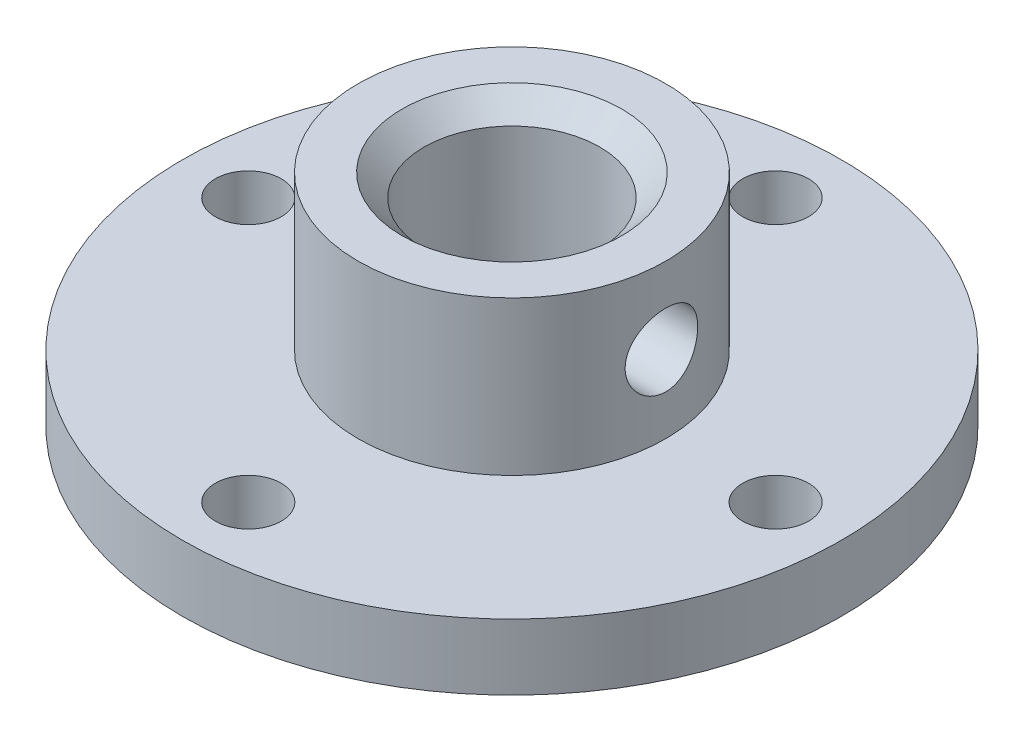
ISO-10303-21;
HEADER;
FILE_DESCRIPTION(('STEP AP214'),'2;1');
FILE_NAME('part.step','',(''),(''),'','','');
FILE_SCHEMA(('AUTOMOTIVE_DESIGN { 1 0 10303 214 1 1 1 1 }'));
ENDSEC;
DATA;
#1=APPLICATION_CONTEXT('core data for automotive mechanical design processes');
#2=APPLICATION_PROTOCOL_DEFINITION('international standard','automotive_design',2000,#1);
#3=PRODUCT_CONTEXT('',#1,'mechanical');
#4=PRODUCT('Part','Part','',(#3));
#5=PRODUCT_RELATED_PRODUCT_CATEGORY('part','',(#4));
#6=PRODUCT_DEFINITION_FORMATION('','',#4);
#7=PRODUCT_DEFINITION_CONTEXT('part definition',#1,'design');
#8=PRODUCT_DEFINITION('design','',#6,#7);
#9=PRODUCT_DEFINITION_SHAPE('','',#8);
#10=(LENGTH_UNIT() NAMED_UNIT(*) SI_UNIT(.MILLI.,.METRE.));
#11=(NAMED_UNIT(*) PLANE_ANGLE_UNIT() SI_UNIT($,.RADIAN.));
#12=(NAMED_UNIT(*) SI_UNIT($,.STERADIAN.) SOLID_ANGLE_UNIT());
#13=UNCERTAINTY_MEASURE_WITH_UNIT(LENGTH_MEASURE(1.E-05),#10,'distance_accuracy_value','');
#14=(GEOMETRIC_REPRESENTATION_CONTEXT(3) GLOBAL_UNCERTAINTY_ASSIGNED_CONTEXT((#13)) GLOBAL_UNIT_ASSIGNED_CONTEXT((#10,
#11,#12)) REPRESENTATION_CONTEXT('',''));
#15=CARTESIAN_POINT('',(0.,0.,0.));
#16=DIRECTION('',(0.,0.,1.));
#17=DIRECTION('',(1.,0.,0.));
#18=AXIS2_PLACEMENT_3D('',#15,#16,#17);
#19=CARTESIAN_POINT('',(0.,3.,0.));
#20=DIRECTION('',(0.,-1.,0.));
#21=DIRECTION('',(0.,0.,-1.));
#22=AXIS2_PLACEMENT_3D('',#19,#20,#21);
#23=CYLINDRICAL_SURFACE('',#22,4.);
#24=CARTESIAN_POINT('',(0.,9.,0.));
#25=DIRECTION('',(0.,1.,0.));
#26=DIRECTION('',(0.,0.,1.));
#27=AXIS2_PLACEMENT_3D('',#24,#25,#26);
#28=CIRCLE('',#27,4.);
#29=CARTESIAN_POINT('',(0.,9.,4.));
#30=VERTEX_POINT('',#29);
#31=EDGE_CURVE('E49',#30,#30,#28,.T.);
#32=ORIENTED_EDGE('',*,*,#31,.T.);
#33=EDGE_LOOP('',(#32));
#34=FACE_BOUND('',#33,.T.);
#35=CARTESIAN_POINT('',(3.64383040220041,6.5,1.65));
#36=CARTESIAN_POINT('',(3.64383945275153,6.58809648022568,1.64999056813102));
#37=CARTESIAN_POINT('',(3.64707173267573,6.67634043197359,1.64289989177358));
#38=CARTESIAN_POINT('',(3.65959209124688,6.85028706107888,1.61480845546373));
#39=CARTESIAN_POINT('',(3.66889676295874,6.9359821005976,1.5937695789634));
#40=CARTESIAN_POINT('',(3.69231325052125,7.10200293813063,1.53873536249638));
#41=CARTESIAN_POINT('',(3.70640571161012,7.1823488202186,1.50479212400174));
#42=CARTESIAN_POINT('',(3.73778230052357,7.33618176683423,1.42506535594207));
#43=CARTESIAN_POINT('',(3.75506562873472,7.40967054278404,1.37928479159595));
#44=CARTESIAN_POINT('',(3.7920553041855,7.5522286878465,1.27419856290372));
#45=CARTESIAN_POINT('',(3.81184277704779,7.62082925578021,1.2142851824136));
#46=CARTESIAN_POINT('',(3.85094363418238,7.74735477190876,1.08391072165483));
#47=CARTESIAN_POINT('',(3.87025683535296,7.80527565147222,1.01344563996364));
#48=CARTESIAN_POINT('',(3.90721575035942,7.91117137130187,0.860301943593383));
#49=CARTESIAN_POINT('',(3.92475616703247,7.95862093270616,0.777232390113592));
#50=CARTESIAN_POINT('',(3.95520283117798,8.0386701453217,0.603436361875858));
#51=CARTESIAN_POINT('',(3.96811109652272,8.07127626434656,0.512713242513046));
#52=CARTESIAN_POINT('',(3.98726403378776,8.11902070665623,0.331105172304399));
#53=CARTESIAN_POINT('',(3.99381564337609,8.13496684792324,0.240465625184493));
#54=CARTESIAN_POINT('',(4.0006306156112,8.15154665185517,0.0575763551498658));
#55=CARTESIAN_POINT('',(4.00089647540932,8.15218639532201,-0.0346727137709547));
#56=CARTESIAN_POINT('',(3.99529224160632,8.13856350386341,-0.212297380895985));
#57=CARTESIAN_POINT('',(3.98978733384658,8.1251878162829,-0.297754665400396));
#58=CARTESIAN_POINT('',(3.97375926025944,8.08543118255225,-0.465085845235279));
#59=CARTESIAN_POINT('',(3.96323572489496,8.05904927870932,-0.546959476205493));
#60=CARTESIAN_POINT('',(3.93798907731603,7.99371233827982,-0.706295606817229));
#61=CARTESIAN_POINT('',(3.92320447216362,7.95457201007513,-0.78367197976247));
#62=CARTESIAN_POINT('',(3.89088763760773,7.8650087208134,-0.930960489992466));
#63=CARTESIAN_POINT('',(3.87335444442336,7.8145817994967,-1.00086999453932));
#64=CARTESIAN_POINT('',(3.83587133640027,7.69981176097137,-1.13638530947041));
#65=CARTESIAN_POINT('',(3.8158381454309,7.63474658910128,-1.20135746318645));
#66=CARTESIAN_POINT('',(3.77653142784555,7.49459033367843,-1.31973838423493));
#67=CARTESIAN_POINT('',(3.75725818494773,7.4194955507367,-1.37314286572202));
#68=CARTESIAN_POINT('',(3.72106607156909,7.25840159645269,-1.46845339844828));
#69=CARTESIAN_POINT('',(3.70424107982558,7.17213242830735,-1.50994179309277));
#70=CARTESIAN_POINT('',(3.67596385006485,6.99295332859411,-1.57754508127096));
#71=CARTESIAN_POINT('',(3.66450786071417,6.90004808612619,-1.60367071206121));
#72=CARTESIAN_POINT('',(3.64919091711418,6.71657710481502,-1.63821320355942));
#73=CARTESIAN_POINT('',(3.64489111171831,6.62624169881714,-1.64765569454682));
#74=CARTESIAN_POINT('',(3.64311980380967,6.44519437030141,-1.65157101672826));
#75=CARTESIAN_POINT('',(3.64564601607449,6.35448258394072,-1.64604885780402));
#76=CARTESIAN_POINT('',(3.65678944366161,6.18119899095053,-1.62112710501827));
#77=CARTESIAN_POINT('',(3.66501803861664,6.09847182032539,-1.60261202118543));
#78=CARTESIAN_POINT('',(3.68614612916707,5.93736293562003,-1.55339580262015));
#79=CARTESIAN_POINT('',(3.69904670212356,5.85898222864834,-1.52269185697123));
#80=CARTESIAN_POINT('',(3.72872477858182,5.70512099430436,-1.44853902204985));
#81=CARTESIAN_POINT('',(3.74564214050945,5.62989980522075,-1.40460979308264));
#82=CARTESIAN_POINT('',(3.78124523189864,5.48753983057027,-1.30573455409451));
#83=CARTESIAN_POINT('',(3.79993171387674,5.42040451226488,-1.25078384473684));
#84=CARTESIAN_POINT('',(3.83876011670653,5.29057037355329,-1.12627542162099));
#85=CARTESIAN_POINT('',(3.85889967217623,5.22864826295128,-1.05590387126704));
#86=CARTESIAN_POINT('',(3.89698114804694,5.11735714433794,-0.905297980080106));
#87=CARTESIAN_POINT('',(3.91492292631236,5.0679889479968,-0.825063002026906));
#88=CARTESIAN_POINT('',(3.94668767391886,4.98329586579321,-0.65651681688327));
#89=CARTESIAN_POINT('',(3.96050313975064,4.94799652499727,-0.568191273870494));
#90=CARTESIAN_POINT('',(3.98237104121021,4.89300834314125,-0.38614083360518));
#91=CARTESIAN_POINT('',(3.9904268305481,4.87331041706106,-0.292419112817564));
#92=CARTESIAN_POINT('',(3.9994889299446,4.85121177107952,-0.109187189544839));
#93=CARTESIAN_POINT('',(4.00094173424749,4.84771517125806,-0.0198303081186384));
#94=CARTESIAN_POINT('',(3.99786220239438,4.85518543437028,0.158161739195409));
#95=CARTESIAN_POINT('',(3.99333087896147,4.86614984999545,0.246797024648477));
#96=CARTESIAN_POINT('',(3.979024148364,4.90144464213556,0.417705375935874));
#97=CARTESIAN_POINT('',(3.96943363922013,4.92530444211455,0.500092371627849));
#98=CARTESIAN_POINT('',(3.94605480923816,4.98520411487999,0.659667355734158));
#99=CARTESIAN_POINT('',(3.93226568297162,5.02124632478668,0.736854343148742));
#100=CARTESIAN_POINT('',(3.90105808483759,5.10630452668639,0.887661133732617));
#101=CARTESIAN_POINT('',(3.88350423911689,5.15583125677293,0.960964214361148));
#102=CARTESIAN_POINT('',(3.84685709666619,5.26570284679,1.09852932170704));
#103=CARTESIAN_POINT('',(3.82776324400832,5.32605162308081,1.1627880603165));
#104=CARTESIAN_POINT('',(3.78859741195738,5.46058752735466,1.28487769945047));
#105=CARTESIAN_POINT('',(3.76854475207571,5.53542775688494,1.34199767947157));
#106=CARTESIAN_POINT('',(3.73105419200533,5.69426597568106,1.4429647467733));
#107=CARTESIAN_POINT('',(3.7136177396712,5.77826899170959,1.48680449811903));
#108=CARTESIAN_POINT('',(3.68370387904713,5.95272844126989,1.55944447766651));
#109=CARTESIAN_POINT('',(3.67119480418033,6.0431391080911,1.58834112875234));
#110=CARTESIAN_POINT('',(3.65281837075147,6.22804714407836,1.63017263567573));
#111=CARTESIAN_POINT('',(3.64692873900432,6.32252969087687,1.64316103312974));
#112=CARTESIAN_POINT('',(3.64414054419779,6.44486331364264,1.6493120932942));
#113=CARTESIAN_POINT('',(3.64382756923722,6.47242443228502,1.6500029523216));
#114=CARTESIAN_POINT('',(3.64383040220041,6.5,1.65));
#115=B_SPLINE_CURVE_WITH_KNOTS('',3,(#35,#36,#37,#38,#39,#40,#41,#42,#43,#44,#45,#46,#47,#48,
#49,#50,#51,#52,#53,#54,#55,#56,#57,#58,#59,#60,#61,#62,#63,#64,#65,#66,#67,#68,#69,#70,#71,#72,
#73,#74,#75,#76,#77,#78,#79,#80,#81,#82,#83,#84,#85,#86,#87,#88,#89,#90,#91,#92,#93,#94,#95,#96,
#97,#98,#99,#100,#101,#102,#103,#104,#105,#106,#107,#108,#109,#110,#111,#112,#113,#114),
.UNSPECIFIED.,.T.,.F.,(4,2,2,2,2,2,2,2,2,2,2,2,2,2,2,2,2,2,2,2,2,2,2,2,2,2,2,2,2,2,2,2,2,2,2,2,
2,2,2,4),(0.,0.264211724660745,0.529148459018597,0.793026677872049,1.05683885985756,
1.33523297260792,1.61373292676209,1.90403076094908,2.19420198072699,2.4695381624427,
2.74476495901024,3.00356896819766,3.26239203686791,3.5251552692474,3.78801084539546,
4.06907613148065,4.35024537535725,4.64031806272423,4.9301877724111,5.20152035698263,
5.47276211576042,5.72713321026166,5.98156300028881,6.24665916965709,6.51186861189124,
6.79815687284347,7.08446363898863,7.37128791456171,7.65794504349151,7.92489841526079,
8.19180661499935,8.44957452423759,8.70739191275388,8.97680852354695,9.24632283025307,
9.53374725602175,9.82133016535516,10.1070334851925,10.3917725616094,10.4744749384332),.UNSPECIFIED.);
#116=CARTESIAN_POINT('',(3.64383040220041,6.5,1.65));
#117=VERTEX_POINT('',#116);
#118=EDGE_CURVE('E86',#117,#117,#115,.T.);
#119=ORIENTED_EDGE('',*,*,#118,.F.);
#120=EDGE_LOOP('',(#119));
#121=FACE_BOUND('',#120,.T.);
#122=CARTESIAN_POINT('',(0.,1.5,0.));
#123=DIRECTION('',(0.,-1.,0.));
#124=DIRECTION('',(0.,0.,-1.));
#125=AXIS2_PLACEMENT_3D('',#122,#123,#124);
#126=CIRCLE('',#125,4.);
#127=CARTESIAN_POINT('',(0.,1.5,-4.));
#128=VERTEX_POINT('',#127);
#129=EDGE_CURVE('E74',#128,#128,#126,.T.);
#130=ORIENTED_EDGE('',*,*,#129,.T.);
#131=EDGE_LOOP('',(#130));
#132=FACE_BOUND('',#131,.T.);
#133=ADVANCED_FACE('F42',(#34,#121,#132),#23,.F.);
#134=CARTESIAN_POINT('',(0.,3.,0.));
#135=DIRECTION('',(0.,1.,0.));
#136=DIRECTION('',(0.,0.,1.));
#137=AXIS2_PLACEMENT_3D('',#134,#135,#136);
#138=PLANE('',#137);
#139=CARTESIAN_POINT('',(12.,3.,1.25693328198353E-13));
#140=DIRECTION('',(0.,1.,0.));
#141=DIRECTION('',(0.,0.,1.));
#142=AXIS2_PLACEMENT_3D('',#139,#140,#141);
#143=CIRCLE('',#142,1.5);
#144=CARTESIAN_POINT('',(12.,3.,1.50000000000013));
#145=VERTEX_POINT('',#144);
#146=EDGE_CURVE('E73',#145,#145,#143,.T.);
#147=ORIENTED_EDGE('',*,*,#146,.F.);
#148=EDGE_LOOP('',(#147));
#149=FACE_BOUND('',#148,.T.);
#150=CARTESIAN_POINT('',(0.,3.,12.));
#151=DIRECTION('',(0.,1.,0.));
#152=DIRECTION('',(0.,0.,1.));
#153=AXIS2_PLACEMENT_3D('',#150,#151,#152);
#154=CIRCLE('',#153,1.5);
#155=CARTESIAN_POINT('',(0.,3.,13.5));
#156=VERTEX_POINT('',#155);
#157=EDGE_CURVE('E277',#156,#156,#154,.T.);
#158=ORIENTED_EDGE('',*,*,#157,.F.);
#159=EDGE_LOOP('',(#158));
#160=FACE_BOUND('',#159,.T.);
#161=CARTESIAN_POINT('',(-12.,3.,0.));
#162=DIRECTION('',(0.,1.,0.));
#163=DIRECTION('',(0.,0.,1.));
#164=AXIS2_PLACEMENT_3D('',#161,#162,#163);
#165=CIRCLE('',#164,1.5);
#166=CARTESIAN_POINT('',(-12.,3.,1.49999999999996));
#167=VERTEX_POINT('',#166);
#168=EDGE_CURVE('E274',#167,#167,#165,.T.);
#169=ORIENTED_EDGE('',*,*,#168,.F.);
#170=EDGE_LOOP('',(#169));
#171=FACE_BOUND('',#170,.T.);
#172=CARTESIAN_POINT('',(0.,3.,-12.));
#173=DIRECTION('',(0.,1.,0.));
#174=DIRECTION('',(0.,0.,1.));
#175=AXIS2_PLACEMENT_3D('',#172,#173,#174);
#176=CIRCLE('',#175,1.5);
#177=CARTESIAN_POINT('',(0.,3.,-10.5));
#178=VERTEX_POINT('',#177);
#179=EDGE_CURVE('E271',#178,#178,#176,.T.);
#180=ORIENTED_EDGE('',*,*,#179,.F.);
#181=EDGE_LOOP('',(#180));
#182=FACE_BOUND('',#181,.T.);
#183=CARTESIAN_POINT('',(0.,3.,0.));
#184=DIRECTION('',(0.,1.,0.));
#185=DIRECTION('',(0.,0.,1.));
#186=AXIS2_PLACEMENT_3D('',#183,#184,#185);
#187=CIRCLE('',#186,15.);
#188=CARTESIAN_POINT('',(0.,3.,15.));
#189=VERTEX_POINT('',#188);
#190=EDGE_CURVE('E53',#189,#189,#187,.T.);
#191=ORIENTED_EDGE('',*,*,#190,.T.);
#192=EDGE_LOOP('',(#191));
#193=FACE_BOUND('',#192,.T.);
#194=CARTESIAN_POINT('',(0.,3.,0.));
#195=DIRECTION('',(0.,1.,0.));
#196=DIRECTION('',(0.,0.,1.));
#197=AXIS2_PLACEMENT_3D('',#194,#195,#196);
#198=CIRCLE('',#197,7.);
#199=CARTESIAN_POINT('',(0.,3.,7.));
#200=VERTEX_POINT('',#199);
#201=EDGE_CURVE('E107',#200,#200,#198,.T.);
#202=ORIENTED_EDGE('',*,*,#201,.F.);
#203=EDGE_LOOP('',(#202));
#204=FACE_BOUND('',#203,.T.);
#205=ADVANCED_FACE('F114',(#149,#160,#171,#182,#193,#204),#138,.T.);
#206=CARTESIAN_POINT('',(0.,0.,0.));
#207=DIRECTION('',(0.,1.,0.));
#208=DIRECTION('',(0.,0.,1.));
#209=AXIS2_PLACEMENT_3D('',#206,#207,#208);
#210=PLANE('',#209);
#211=CARTESIAN_POINT('',(12.,0.,1.25693328198353E-13));
#212=DIRECTION('',(0.,1.,0.));
#213=DIRECTION('',(0.,0.,1.));
#214=AXIS2_PLACEMENT_3D('',#211,#212,#213);
#215=CIRCLE('',#214,1.5);
#216=CARTESIAN_POINT('',(12.,0.,1.50000000000013));
#217=VERTEX_POINT('',#216);
#218=EDGE_CURVE('E60',#217,#217,#215,.T.);
#219=ORIENTED_EDGE('',*,*,#218,.T.);
#220=EDGE_LOOP('',(#219));
#221=FACE_BOUND('',#220,.T.);
#222=CARTESIAN_POINT('',(0.,0.,12.));
#223=DIRECTION('',(0.,1.,0.));
#224=DIRECTION('',(0.,0.,1.));
#225=AXIS2_PLACEMENT_3D('',#222,#223,#224);
#226=CIRCLE('',#225,1.5);
#227=CARTESIAN_POINT('',(0.,0.,13.5));
#228=VERTEX_POINT('',#227);
#229=EDGE_CURVE('E64',#228,#228,#226,.T.);
#230=ORIENTED_EDGE('',*,*,#229,.T.);
#231=EDGE_LOOP('',(#230));
#232=FACE_BOUND('',#231,.T.);
#233=CARTESIAN_POINT('',(-12.,0.,0.));
#234=DIRECTION('',(0.,1.,0.));
#235=DIRECTION('',(0.,0.,1.));
#236=AXIS2_PLACEMENT_3D('',#233,#234,#235);
#237=CIRCLE('',#236,1.5);
#238=CARTESIAN_POINT('',(-12.,0.,1.49999999999996));
#239=VERTEX_POINT('',#238);
#240=EDGE_CURVE('E67',#239,#239,#237,.T.);
#241=ORIENTED_EDGE('',*,*,#240,.T.);
#242=EDGE_LOOP('',(#241));
#243=FACE_BOUND('',#242,.T.);
#244=CARTESIAN_POINT('',(0.,0.,-12.));
#245=DIRECTION('',(0.,1.,0.));
#246=DIRECTION('',(0.,0.,1.));
#247=AXIS2_PLACEMENT_3D('',#244,#245,#246);
#248=CIRCLE('',#247,1.5);
#249=CARTESIAN_POINT('',(0.,0.,-10.5));
#250=VERTEX_POINT('',#249);
#251=EDGE_CURVE('E70',#250,#250,#248,.T.);
#252=ORIENTED_EDGE('',*,*,#251,.T.);
#253=EDGE_LOOP('',(#252));
#254=FACE_BOUND('',#253,.T.);
#255=CARTESIAN_POINT('',(0.,0.,0.));
#256=DIRECTION('',(0.,-1.,0.));
#257=DIRECTION('',(0.,0.,-1.));
#258=AXIS2_PLACEMENT_3D('',#255,#256,#257);
#259=CIRCLE('',#258,6.5);
#260=CARTESIAN_POINT('',(0.,0.,-6.5));
#261=VERTEX_POINT('',#260);
#262=EDGE_CURVE('E63',#261,#261,#259,.T.);
#263=ORIENTED_EDGE('',*,*,#262,.F.);
#264=EDGE_LOOP('',(#263));
#265=FACE_BOUND('',#264,.T.);
#266=CARTESIAN_POINT('',(0.,0.,0.));
#267=DIRECTION('',(0.,1.,0.));
#268=DIRECTION('',(0.,0.,1.));
#269=AXIS2_PLACEMENT_3D('',#266,#267,#268);
#270=CIRCLE('',#269,15.);
#271=CARTESIAN_POINT('',(0.,0.,15.));
#272=VERTEX_POINT('',#271);
#273=EDGE_CURVE('E57',#272,#272,#270,.T.);
#274=ORIENTED_EDGE('',*,*,#273,.F.);
#275=EDGE_LOOP('',(#274));
#276=FACE_BOUND('',#275,.T.);
#277=ADVANCED_FACE('F117',(#221,#232,#243,#254,#265,#276),#210,.F.);
#278=CARTESIAN_POINT('',(0.,3.,0.));
#279=DIRECTION('',(0.,-1.,0.));
#280=DIRECTION('',(0.,0.,-1.));
#281=AXIS2_PLACEMENT_3D('',#278,#279,#280);
#282=CYLINDRICAL_SURFACE('',#281,15.);
#283=ORIENTED_EDGE('',*,*,#190,.F.);
#284=EDGE_LOOP('',(#283));
#285=FACE_BOUND('',#284,.T.);
#286=ORIENTED_EDGE('',*,*,#273,.T.);
#287=EDGE_LOOP('',(#286));
#288=FACE_BOUND('',#287,.T.);
#289=ADVANCED_FACE('F120',(#285,#288),#282,.T.);
#290=CARTESIAN_POINT('',(0.,10.,0.));
#291=DIRECTION('',(0.,1.,0.));
#292=DIRECTION('',(0.,0.,1.));
#293=AXIS2_PLACEMENT_3D('',#290,#291,#292);
#294=PLANE('',#293);
#295=CARTESIAN_POINT('',(0.,10.,0.));
#296=DIRECTION('',(0.,1.,0.));
#297=DIRECTION('',(0.,0.,1.));
#298=AXIS2_PLACEMENT_3D('',#295,#296,#297);
#299=CIRCLE('',#298,5.);
#300=CARTESIAN_POINT('',(0.,10.,5.));
#301=VERTEX_POINT('',#300);
#302=EDGE_CURVE('E11',#301,#301,#299,.F.);
#303=ORIENTED_EDGE('',*,*,#302,.T.);
#304=EDGE_LOOP('',(#303));
#305=FACE_BOUND('',#304,.T.);
#306=CARTESIAN_POINT('',(0.,10.,0.));
#307=DIRECTION('',(0.,1.,0.));
#308=DIRECTION('',(0.,0.,1.));
#309=AXIS2_PLACEMENT_3D('',#306,#307,#308);
#310=CIRCLE('',#309,7.);
#311=CARTESIAN_POINT('',(0.,10.,7.));
#312=VERTEX_POINT('',#311);
#313=EDGE_CURVE('E109',#312,#312,#310,.T.);
#314=ORIENTED_EDGE('',*,*,#313,.T.);
#315=EDGE_LOOP('',(#314));
#316=FACE_BOUND('',#315,.T.);
#317=ADVANCED_FACE('F98',(#305,#316),#294,.T.);
#318=CARTESIAN_POINT('',(0.,10.,0.));
#319=DIRECTION('',(0.,-1.,0.));
#320=DIRECTION('',(0.,0.,-1.));
#321=AXIS2_PLACEMENT_3D('',#318,#319,#320);
#322=CYLINDRICAL_SURFACE('',#321,7.);
#323=CARTESIAN_POINT('',(6.80275679412398,6.5,1.65));
#324=CARTESIAN_POINT('',(6.80275861136205,6.59128900002348,1.64999713007316));
#325=CARTESIAN_POINT('',(6.80461440498174,6.6826109983811,1.64239813439995));
#326=CARTESIAN_POINT('',(6.81182064992733,6.86264456343403,1.61224414767597));
#327=CARTESIAN_POINT('',(6.81717336620826,6.95135439928855,1.58967946321206));
#328=CARTESIAN_POINT('',(6.83073431325551,7.12353351252337,1.53035515036094));
#329=CARTESIAN_POINT('',(6.83893911932177,7.2070089339595,1.49361254058449));
#330=CARTESIAN_POINT('',(6.85727558075245,7.36661653279005,1.40702581854958));
#331=CARTESIAN_POINT('',(6.86740726130097,7.44274861418793,1.3571815350499));
#332=CARTESIAN_POINT('',(6.88867782513987,7.58699982868595,1.24476461908352));
#333=CARTESIAN_POINT('',(6.89983131541127,7.65495404527719,1.18198309355868));
#334=CARTESIAN_POINT('',(6.92176152937784,7.77947171170117,1.04592427298928));
#335=CARTESIAN_POINT('',(6.93253822068664,7.83603418437752,0.972646078487497));
#336=CARTESIAN_POINT('',(6.95266103704034,7.93682696981727,0.816555491676996));
#337=CARTESIAN_POINT('',(6.96198791366554,7.98089686123285,0.733636814479666));
#338=CARTESIAN_POINT('',(6.97799434603916,8.05441290827777,0.561312838562636));
#339=CARTESIAN_POINT('',(6.98467424785277,8.08386097569016,0.471908389601372));
#340=CARTESIAN_POINT('',(6.99453084372035,8.12677370217112,0.290868022052414));
#341=CARTESIAN_POINT('',(6.99776875317269,8.14051799396695,0.19930177571546));
#342=CARTESIAN_POINT('',(7.00058928212562,8.15250913676126,0.0151097839078777));
#343=CARTESIAN_POINT('',(7.00017238432294,8.15075803426303,-0.0775158200378351));
#344=CARTESIAN_POINT('',(6.99577641572093,8.13201259498984,-0.259263367840032));
#345=CARTESIAN_POINT('',(6.99186783471482,8.11531988499546,-0.348418380319068));
#346=CARTESIAN_POINT('',(6.98100889430398,8.06764792556427,-0.52262462498376));
#347=CARTESIAN_POINT('',(6.97405838372646,8.03666796609913,-0.607675652983099));
#348=CARTESIAN_POINT('',(6.95778608866946,7.96104622960672,-0.772074386794551));
#349=CARTESIAN_POINT('',(6.94844521053821,7.91629382953034,-0.851369239725045));
#350=CARTESIAN_POINT('',(6.92841069918987,7.81448077411501,-1.00143136070301));
#351=CARTESIAN_POINT('',(6.91771685448099,7.75741819349896,-1.07219729215003));
#352=CARTESIAN_POINT('',(6.89584251761335,7.63097547490599,-1.20498965605832));
#353=CARTESIAN_POINT('',(6.88465650871199,7.56133150430551,-1.26676421005725));
#354=CARTESIAN_POINT('',(6.8632971795881,7.4125556788502,-1.37780936391993));
#355=CARTESIAN_POINT('',(6.85312389657327,7.33342347563159,-1.42707950447265));
#356=CARTESIAN_POINT('',(6.83492437266263,7.16746474019295,-1.51185477157774));
#357=CARTESIAN_POINT('',(6.82690665922475,7.08060940604915,-1.54730546989208));
#358=CARTESIAN_POINT('',(6.8140390867396,6.90193872243084,-1.6030277151278));
#359=CARTESIAN_POINT('',(6.80918863409247,6.81012430586923,-1.62330210645788));
#360=CARTESIAN_POINT('',(6.80332774943589,6.62646144305076,-1.64769127898038));
#361=CARTESIAN_POINT('',(6.80222947433876,6.53466484026994,-1.65217579860456));
#362=CARTESIAN_POINT('',(6.80375919481422,6.35163542341626,-1.64586488795024));
#363=CARTESIAN_POINT('',(6.80638688917233,6.26040256436811,-1.63507069283233));
#364=CARTESIAN_POINT('',(6.81498886694796,6.08242254925254,-1.59883140460811));
#365=CARTESIAN_POINT('',(6.82091521063605,5.99563015434626,-1.57359604251708));
#366=CARTESIAN_POINT('',(6.83540229380027,5.82750631336549,-1.50942069873873));
#367=CARTESIAN_POINT('',(6.84396331787599,5.74617545840622,-1.47047923644585));
#368=CARTESIAN_POINT('',(6.86294389007106,5.58970094341062,-1.37920410959565));
#369=CARTESIAN_POINT('',(6.87339357272798,5.51469181525747,-1.32664621508517));
#370=CARTESIAN_POINT('',(6.89489755256543,5.37442199370178,-1.20991829013253));
#371=CARTESIAN_POINT('',(6.90595193742742,5.30916271916839,-1.14574657256199));
#372=CARTESIAN_POINT('',(6.92771364919943,5.18877701795745,-1.00592681617982));
#373=CARTESIAN_POINT('',(6.93840801965821,5.13390464452841,-0.930057660220532));
#374=CARTESIAN_POINT('',(6.95799159344945,5.03768198322209,-0.76996522075895));
#375=CARTESIAN_POINT('',(6.96688088727282,4.99633101743495,-0.685742356354561));
#376=CARTESIAN_POINT('',(6.98179887024889,4.92866216106669,-0.511894272134561));
#377=CARTESIAN_POINT('',(6.98784709878863,4.90224132543239,-0.422310877248035));
#378=CARTESIAN_POINT('',(6.99648655479454,4.86486713105854,-0.239816201973851));
#379=CARTESIAN_POINT('',(6.99907837091255,4.85391113852667,-0.146905491020369));
#380=CARTESIAN_POINT('',(7.00049202890772,4.84791186942867,0.0372082467747353));
#381=CARTESIAN_POINT('',(6.9994031706394,4.85249167573904,0.128398504210686));
#382=CARTESIAN_POINT('',(6.99377268350157,4.87658024729473,0.308670729816516));
#383=CARTESIAN_POINT('',(6.98923113721447,4.89608865547342,0.397752748359328));
#384=CARTESIAN_POINT('',(6.97721604451341,4.94928823891072,0.570933576895641));
#385=CARTESIAN_POINT('',(6.96975517685192,4.98291812948868,0.655052149359145));
#386=CARTESIAN_POINT('',(6.95269208722048,5.0633490089208,0.81649879536476));
#387=CARTESIAN_POINT('',(6.94308962308136,5.11015148747236,0.893826099578997));
#388=CARTESIAN_POINT('',(6.92252474173611,5.21678609644666,1.04130725997213));
#389=CARTESIAN_POINT('',(6.91153737485731,5.27687846979488,1.11126948147334));
#390=CARTESIAN_POINT('',(6.88956325338245,5.40787239751113,1.24024523339421));
#391=CARTESIAN_POINT('',(6.87857649960749,5.47877661725911,1.29925605605595));
#392=CARTESIAN_POINT('',(6.85764827463158,5.63075459385527,1.40557849643651));
#393=CARTESIAN_POINT('',(6.84772646444862,5.71197361147869,1.45268661539722));
#394=CARTESIAN_POINT('',(6.83030721412674,5.88139733375313,1.53250931126199));
#395=CARTESIAN_POINT('',(6.82280787287529,5.96959649249444,1.56523518241758));
#396=CARTESIAN_POINT('',(6.81235745600281,6.13146915440948,1.61002842680637));
#397=CARTESIAN_POINT('',(6.80878274857867,6.20431600484432,1.62498700416516));
#398=CARTESIAN_POINT('',(6.8039817559383,6.35143468153228,1.64497362976398));
#399=CARTESIAN_POINT('',(6.80275531520391,6.42570641309105,1.65000233562816));
#400=CARTESIAN_POINT('',(6.80275679412398,6.5,1.65));
#401=B_SPLINE_CURVE_WITH_KNOTS('',3,(#323,#324,#325,#326,#327,#328,#329,#330,#331,#332,#333,
#334,#335,#336,#337,#338,#339,#340,#341,#342,#343,#344,#345,#346,#347,#348,#349,#350,#351,#352,
#353,#354,#355,#356,#357,#358,#359,#360,#361,#362,#363,#364,#365,#366,#367,#368,#369,#370,#371,
#372,#373,#374,#375,#376,#377,#378,#379,#380,#381,#382,#383,#384,#385,#386,#387,#388,#389,#390,
#391,#392,#393,#394,#395,#396,#397,#398,#399,#400),.UNSPECIFIED.,.T.,.F.,(4,2,2,2,2,2,2,2,2,2,2,
2,2,2,2,2,2,2,2,2,2,2,2,2,2,2,2,2,2,2,2,2,2,2,2,2,2,2,4),(0.,0.273594440399259,
0.547366263700774,0.820810479503745,1.0942582694491,1.37252656286893,1.65081871531698,
1.9325374796075,2.21421939985748,2.49080324523182,2.76735056224876,3.03843805884697,
3.30953902903524,3.5828770280852,3.85625780745004,4.13623055025586,4.41621357550839,
4.69728844125184,4.97831061353603,5.25270687968444,5.52708096437946,5.79756789407088,
6.06808405216623,6.34337456664897,6.61870510445458,6.90008328124663,7.18144734868654,
7.46084693391317,7.74019892930652,8.01282246332763,8.28543947686366,8.55688541369868,
8.82836206089266,9.10571835709369,9.38314313916058,9.66503130549496,9.94669771026971,
10.1693714016501,10.3920303455577),.UNSPECIFIED.);
#402=CARTESIAN_POINT('',(6.80275679412398,6.5,1.65));
#403=VERTEX_POINT('',#402);
#404=EDGE_CURVE('E77',#403,#403,#401,.T.);
#405=ORIENTED_EDGE('',*,*,#404,.T.);
#406=EDGE_LOOP('',(#405));
#407=FACE_BOUND('',#406,.T.);
#408=ORIENTED_EDGE('',*,*,#313,.F.);
#409=EDGE_LOOP('',(#408));
#410=FACE_BOUND('',#409,.T.);
#411=ORIENTED_EDGE('',*,*,#201,.T.);
#412=EDGE_LOOP('',(#411));
#413=FACE_BOUND('',#412,.T.);
#414=ADVANCED_FACE('F87',(#407,#410,#413),#322,.T.);
#415=CARTESIAN_POINT('',(12.,6.5,0.));
#416=DIRECTION('',(-1.,0.,0.));
#417=DIRECTION('',(0.,0.,1.));
#418=AXIS2_PLACEMENT_3D('',#415,#416,#417);
#419=CYLINDRICAL_SURFACE('',#418,1.65);
#420=ORIENTED_EDGE('',*,*,#118,.T.);
#421=EDGE_LOOP('',(#420));
#422=FACE_BOUND('',#421,.T.);
#423=ORIENTED_EDGE('',*,*,#404,.F.);
#424=EDGE_LOOP('',(#423));
#425=FACE_BOUND('',#424,.T.);
#426=ADVANCED_FACE('F91',(#422,#425),#419,.F.);
#427=CARTESIAN_POINT('',(0.,1.5,0.));
#428=DIRECTION('',(0.,-1.,0.));
#429=DIRECTION('',(0.,0.,-1.));
#430=AXIS2_PLACEMENT_3D('',#427,#428,#429);
#431=CYLINDRICAL_SURFACE('',#430,6.5);
#432=CARTESIAN_POINT('',(0.,1.5,0.));
#433=DIRECTION('',(0.,-1.,0.));
#434=DIRECTION('',(0.,0.,-1.));
#435=AXIS2_PLACEMENT_3D('',#432,#433,#434);
#436=CIRCLE('',#435,6.5);
#437=CARTESIAN_POINT('',(0.,1.5,-6.5));
#438=VERTEX_POINT('',#437);
#439=EDGE_CURVE('E78',#438,#438,#436,.T.);
#440=ORIENTED_EDGE('',*,*,#439,.F.);
#441=EDGE_LOOP('',(#440));
#442=FACE_BOUND('',#441,.T.);
#443=ORIENTED_EDGE('',*,*,#262,.T.);
#444=EDGE_LOOP('',(#443));
#445=FACE_BOUND('',#444,.T.);
#446=ADVANCED_FACE('F95',(#442,#445),#431,.F.);
#447=CARTESIAN_POINT('',(0.,1.5,0.));
#448=DIRECTION('',(0.,-1.,0.));
#449=DIRECTION('',(0.,0.,-1.));
#450=AXIS2_PLACEMENT_3D('',#447,#448,#449);
#451=PLANE('',#450);
#452=ORIENTED_EDGE('',*,*,#129,.F.);
#453=EDGE_LOOP('',(#452));
#454=FACE_BOUND('',#453,.T.);
#455=ORIENTED_EDGE('',*,*,#439,.T.);
#456=EDGE_LOOP('',(#455));
#457=FACE_BOUND('',#456,.T.);
#458=ADVANCED_FACE('F158',(#454,#457),#451,.T.);
#459=CARTESIAN_POINT('',(0.,-1.,-12.));
#460=DIRECTION('',(0.,1.,0.));
#461=DIRECTION('',(0.,0.,1.));
#462=AXIS2_PLACEMENT_3D('',#459,#460,#461);
#463=CYLINDRICAL_SURFACE('',#462,1.5);
#464=ORIENTED_EDGE('',*,*,#179,.T.);
#465=EDGE_LOOP('',(#464));
#466=FACE_BOUND('',#465,.T.);
#467=ORIENTED_EDGE('',*,*,#251,.F.);
#468=EDGE_LOOP('',(#467));
#469=FACE_BOUND('',#468,.T.);
#470=ADVANCED_FACE('F165',(#466,#469),#463,.F.);
#471=CARTESIAN_POINT('',(-12.,-1.,0.));
#472=DIRECTION('',(0.,1.,0.));
#473=DIRECTION('',(0.,0.,1.));
#474=AXIS2_PLACEMENT_3D('',#471,#472,#473);
#475=CYLINDRICAL_SURFACE('',#474,1.5);
#476=ORIENTED_EDGE('',*,*,#168,.T.);
#477=EDGE_LOOP('',(#476));
#478=FACE_BOUND('',#477,.T.);
#479=ORIENTED_EDGE('',*,*,#240,.F.);
#480=EDGE_LOOP('',(#479));
#481=FACE_BOUND('',#480,.T.);
#482=ADVANCED_FACE('F173',(#478,#481),#475,.F.);
#483=CARTESIAN_POINT('',(0.,-1.,12.));
#484=DIRECTION('',(0.,1.,0.));
#485=DIRECTION('',(0.,0.,1.));
#486=AXIS2_PLACEMENT_3D('',#483,#484,#485);
#487=CYLINDRICAL_SURFACE('',#486,1.5);
#488=ORIENTED_EDGE('',*,*,#157,.T.);
#489=EDGE_LOOP('',(#488));
#490=FACE_BOUND('',#489,.T.);
#491=ORIENTED_EDGE('',*,*,#229,.F.);
#492=EDGE_LOOP('',(#491));
#493=FACE_BOUND('',#492,.T.);
#494=ADVANCED_FACE('F182',(#490,#493),#487,.F.);
#495=CARTESIAN_POINT('',(12.,-1.,1.25693328198353E-13));
#496=DIRECTION('',(0.,1.,0.));
#497=DIRECTION('',(0.,0.,1.));
#498=AXIS2_PLACEMENT_3D('',#495,#496,#497);
#499=CYLINDRICAL_SURFACE('',#498,1.5);
#500=ORIENTED_EDGE('',*,*,#146,.T.);
#501=EDGE_LOOP('',(#500));
#502=FACE_BOUND('',#501,.T.);
#503=ORIENTED_EDGE('',*,*,#218,.F.);
#504=EDGE_LOOP('',(#503));
#505=FACE_BOUND('',#504,.T.);
#506=ADVANCED_FACE('F190',(#502,#505),#499,.F.);
#507=CARTESIAN_POINT('',(0.,9.,0.));
#508=DIRECTION('',(0.,1.,0.));
#509=DIRECTION('',(0.,0.,1.));
#510=AXIS2_PLACEMENT_3D('',#507,#508,#509);
#511=CONICAL_SURFACE('',#510,4.,0.78539816339745);
#512=ORIENTED_EDGE('',*,*,#302,.F.);
#513=EDGE_LOOP('',(#512));
#514=FACE_BOUND('',#513,.T.);
#515=ORIENTED_EDGE('',*,*,#31,.F.);
#516=EDGE_LOOP('',(#515));
#517=FACE_BOUND('',#516,.T.);
#518=ADVANCED_FACE('F44',(#514,#517),#511,.F.);
#519=CLOSED_SHELL('',(#133,#205,#277,#289,#317,#414,#426,#446,#458,#470,#482,#494,#506,#518));
#520=MANIFOLD_SOLID_BREP('B2',#519);
#521=ADVANCED_BREP_SHAPE_REPRESENTATION('',(#18,#520),#14);
#522=SHAPE_DEFINITION_REPRESENTATION(#9,#521);
ENDSEC;
END-ISO-10303-21;
